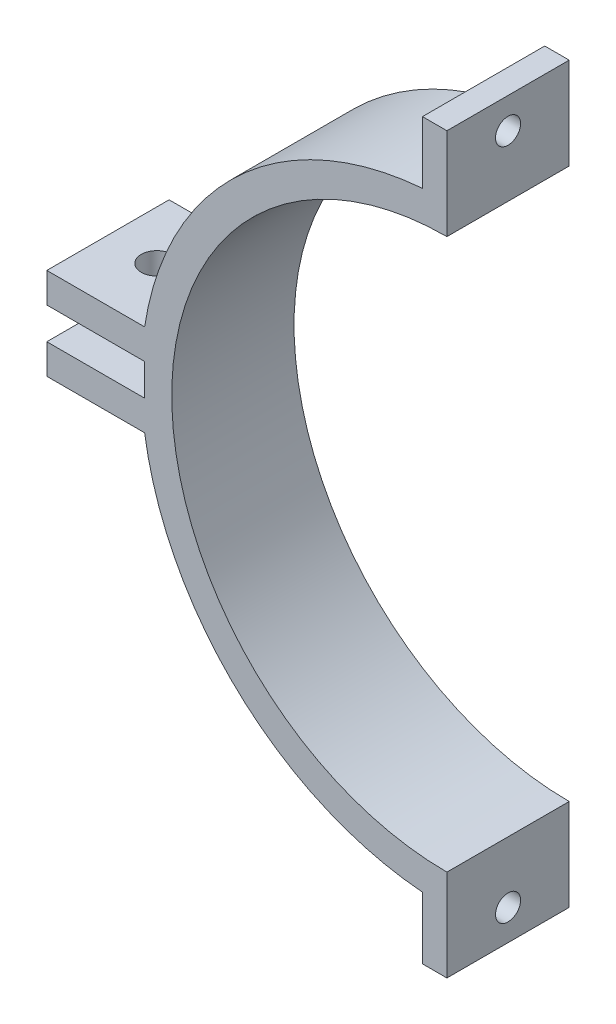
ISO-10303-21;
HEADER;
FILE_DESCRIPTION(('STEP AP214'),'2;1');
FILE_NAME('part.step','',(''),(''),'','','');
FILE_SCHEMA(('AUTOMOTIVE_DESIGN { 1 0 10303 214 1 1 1 1 }'));
ENDSEC;
DATA;
#1=APPLICATION_CONTEXT('core data for automotive mechanical design processes');
#2=APPLICATION_PROTOCOL_DEFINITION('international standard','automotive_design',2000,#1);
#3=PRODUCT_CONTEXT('',#1,'mechanical');
#4=PRODUCT('Part','Part','',(#3));
#5=PRODUCT_RELATED_PRODUCT_CATEGORY('part','',(#4));
#6=PRODUCT_DEFINITION_FORMATION('','',#4);
#7=PRODUCT_DEFINITION_CONTEXT('part definition',#1,'design');
#8=PRODUCT_DEFINITION('design','',#6,#7);
#9=PRODUCT_DEFINITION_SHAPE('','',#8);
#10=(LENGTH_UNIT() NAMED_UNIT(*) SI_UNIT(.MILLI.,.METRE.));
#11=(NAMED_UNIT(*) PLANE_ANGLE_UNIT() SI_UNIT($,.RADIAN.));
#12=(NAMED_UNIT(*) SI_UNIT($,.STERADIAN.) SOLID_ANGLE_UNIT());
#13=UNCERTAINTY_MEASURE_WITH_UNIT(LENGTH_MEASURE(1.E-05),#10,'distance_accuracy_value','');
#14=(GEOMETRIC_REPRESENTATION_CONTEXT(3) GLOBAL_UNCERTAINTY_ASSIGNED_CONTEXT((#13)) GLOBAL_UNIT_ASSIGNED_CONTEXT((#10,
#11,#12)) REPRESENTATION_CONTEXT('',''));
#15=CARTESIAN_POINT('',(0.,0.,0.));
#16=DIRECTION('',(0.,0.,1.));
#17=DIRECTION('',(1.,0.,0.));
#18=AXIS2_PLACEMENT_3D('',#15,#16,#17);
#19=CARTESIAN_POINT('',(0.,0.,0.));
#20=DIRECTION('',(0.,0.,1.));
#21=DIRECTION('',(1.,0.,0.));
#22=AXIS2_PLACEMENT_3D('',#19,#20,#21);
#23=PLANE('',#22);
#24=DIRECTION('',(-1.,0.,0.));
#25=VECTOR('',#24,1.);
#26=CARTESIAN_POINT('',(-49.434299833213,2.6,0.));
#27=LINE('',#26,#25);
#28=CARTESIAN_POINT('',(-49.434299833213,2.6,0.));
#29=VERTEX_POINT('',#28);
#30=CARTESIAN_POINT('',(-65.434299833213,2.6,0.));
#31=VERTEX_POINT('',#30);
#32=EDGE_CURVE('E446',#29,#31,#27,.T.);
#33=ORIENTED_EDGE('',*,*,#32,.T.);
#34=DIRECTION('',(0.,1.,0.));
#35=VECTOR('',#34,1.);
#36=CARTESIAN_POINT('',(-65.434299833213,0.,0.));
#37=LINE('',#36,#35);
#38=CARTESIAN_POINT('',(-65.434299833213,7.5,0.));
#39=VERTEX_POINT('',#38);
#40=EDGE_CURVE('E294',#31,#39,#37,.T.);
#41=ORIENTED_EDGE('',*,*,#40,.T.);
#42=DIRECTION('',(-1.,0.,0.));
#43=VECTOR('',#42,1.);
#44=CARTESIAN_POINT('',(0.,7.50000000000001,0.));
#45=LINE('',#44,#43);
#46=CARTESIAN_POINT('',(-49.434299833213,7.5,0.));
#47=VERTEX_POINT('',#46);
#48=EDGE_CURVE('E291',#47,#39,#45,.T.);
#49=ORIENTED_EDGE('',*,*,#48,.F.);
#50=CARTESIAN_POINT('',(0.,0.,0.));
#51=DIRECTION('',(0.,0.,1.));
#52=DIRECTION('',(1.,0.,0.));
#53=AXIS2_PLACEMENT_3D('',#50,#51,#52);
#54=CIRCLE('',#53,50.);
#55=CARTESIAN_POINT('',(-4.,49.8397431775085,0.));
#56=VERTEX_POINT('',#55);
#57=EDGE_CURVE('E335',#56,#47,#54,.T.);
#58=ORIENTED_EDGE('',*,*,#57,.F.);
#59=DIRECTION('',(0.,-1.,0.));
#60=VECTOR('',#59,1.);
#61=CARTESIAN_POINT('',(-3.99999999999999,0.,0.));
#62=LINE('',#61,#60);
#63=CARTESIAN_POINT('',(-4.,60.,0.));
#64=VERTEX_POINT('',#63);
#65=EDGE_CURVE('E333',#64,#56,#62,.T.);
#66=ORIENTED_EDGE('',*,*,#65,.F.);
#67=DIRECTION('',(-1.,0.,0.));
#68=VECTOR('',#67,1.);
#69=CARTESIAN_POINT('',(0.,60.,0.));
#70=LINE('',#69,#68);
#71=CARTESIAN_POINT('',(0.,60.,0.));
#72=VERTEX_POINT('',#71);
#73=EDGE_CURVE('E264',#72,#64,#70,.T.);
#74=ORIENTED_EDGE('',*,*,#73,.F.);
#75=DIRECTION('',(0.,1.,0.));
#76=VECTOR('',#75,1.);
#77=CARTESIAN_POINT('',(0.,0.,0.));
#78=LINE('',#77,#76);
#79=CARTESIAN_POINT('',(0.,45.,0.));
#80=VERTEX_POINT('',#79);
#81=EDGE_CURVE('E248',#80,#72,#78,.T.);
#82=ORIENTED_EDGE('',*,*,#81,.F.);
#83=CARTESIAN_POINT('',(0.,0.,0.));
#84=DIRECTION('',(0.,0.,1.));
#85=DIRECTION('',(1.,0.,0.));
#86=AXIS2_PLACEMENT_3D('',#83,#84,#85);
#87=CIRCLE('',#86,45.);
#88=CARTESIAN_POINT('',(0.,-45.,0.));
#89=VERTEX_POINT('',#88);
#90=EDGE_CURVE('E262',#80,#89,#87,.T.);
#91=ORIENTED_EDGE('',*,*,#90,.T.);
#92=DIRECTION('',(0.,-1.,0.));
#93=VECTOR('',#92,1.);
#94=CARTESIAN_POINT('',(0.,0.,0.));
#95=LINE('',#94,#93);
#96=CARTESIAN_POINT('',(0.,-60.,0.));
#97=VERTEX_POINT('',#96);
#98=EDGE_CURVE('E270',#89,#97,#95,.T.);
#99=ORIENTED_EDGE('',*,*,#98,.T.);
#100=DIRECTION('',(-1.,0.,0.));
#101=VECTOR('',#100,1.);
#102=CARTESIAN_POINT('',(0.,-60.,0.));
#103=LINE('',#102,#101);
#104=CARTESIAN_POINT('',(-4.,-60.,0.));
#105=VERTEX_POINT('',#104);
#106=EDGE_CURVE('E274',#97,#105,#103,.T.);
#107=ORIENTED_EDGE('',*,*,#106,.T.);
#108=DIRECTION('',(0.,1.,0.));
#109=VECTOR('',#108,1.);
#110=CARTESIAN_POINT('',(-3.99999999999999,0.,0.));
#111=LINE('',#110,#109);
#112=CARTESIAN_POINT('',(-4.,-49.8397431775085,0.));
#113=VERTEX_POINT('',#112);
#114=EDGE_CURVE('E339',#105,#113,#111,.T.);
#115=ORIENTED_EDGE('',*,*,#114,.T.);
#116=CARTESIAN_POINT('',(-49.434299833213,-7.5,0.));
#117=VERTEX_POINT('',#116);
#118=EDGE_CURVE('E338',#117,#113,#54,.T.);
#119=ORIENTED_EDGE('',*,*,#118,.F.);
#120=DIRECTION('',(-1.,0.,0.));
#121=VECTOR('',#120,1.);
#122=CARTESIAN_POINT('',(0.,-7.49999999999999,0.));
#123=LINE('',#122,#121);
#124=CARTESIAN_POINT('',(-65.434299833213,-7.5,0.));
#125=VERTEX_POINT('',#124);
#126=EDGE_CURVE('E306',#117,#125,#123,.T.);
#127=ORIENTED_EDGE('',*,*,#126,.T.);
#128=CARTESIAN_POINT('',(-65.434299833213,-2.6,0.));
#129=VERTEX_POINT('',#128);
#130=EDGE_CURVE('E299',#125,#129,#37,.T.);
#131=ORIENTED_EDGE('',*,*,#130,.T.);
#132=DIRECTION('',(-1.,0.,0.));
#133=VECTOR('',#132,1.);
#134=CARTESIAN_POINT('',(-49.434299833213,-2.6,0.));
#135=LINE('',#134,#133);
#136=CARTESIAN_POINT('',(-49.434299833213,-2.6,0.));
#137=VERTEX_POINT('',#136);
#138=EDGE_CURVE('E370',#137,#129,#135,.T.);
#139=ORIENTED_EDGE('',*,*,#138,.F.);
#140=DIRECTION('',(0.,-1.,0.));
#141=VECTOR('',#140,1.);
#142=CARTESIAN_POINT('',(-49.434299833213,0.,0.));
#143=LINE('',#142,#141);
#144=EDGE_CURVE('E437',#29,#137,#143,.T.);
#145=ORIENTED_EDGE('',*,*,#144,.F.);
#146=EDGE_LOOP('',(#33,#41,#49,#58,#66,#74,#82,#91,#99,#107,#115,#119,#127,#131,#139,#145));
#147=FACE_BOUND('',#146,.T.);
#148=ADVANCED_FACE('F151',(#147),#23,.F.);
#149=CARTESIAN_POINT('',(-65.434299833213,0.,20.));
#150=DIRECTION('',(-1.,0.,0.));
#151=DIRECTION('',(0.,0.,1.));
#152=AXIS2_PLACEMENT_3D('',#149,#150,#151);
#153=PLANE('',#152);
#154=ORIENTED_EDGE('',*,*,#40,.F.);
#155=DIRECTION('',(0.,0.,1.));
#156=VECTOR('',#155,1.);
#157=CARTESIAN_POINT('',(-65.434299833213,2.6,0.));
#158=LINE('',#157,#156);
#159=CARTESIAN_POINT('',(-65.434299833213,2.6,20.));
#160=VERTEX_POINT('',#159);
#161=EDGE_CURVE('E393',#31,#160,#158,.T.);
#162=ORIENTED_EDGE('',*,*,#161,.T.);
#163=DIRECTION('',(0.,1.,0.));
#164=VECTOR('',#163,1.);
#165=CARTESIAN_POINT('',(-65.434299833213,0.,20.));
#166=LINE('',#165,#164);
#167=CARTESIAN_POINT('',(-65.434299833213,7.5,20.));
#168=VERTEX_POINT('',#167);
#169=EDGE_CURVE('E389',#160,#168,#166,.T.);
#170=ORIENTED_EDGE('',*,*,#169,.T.);
#171=DIRECTION('',(0.,0.,-1.));
#172=VECTOR('',#171,1.);
#173=CARTESIAN_POINT('',(-65.434299833213,7.5,20.));
#174=LINE('',#173,#172);
#175=EDGE_CURVE('E160',#168,#39,#174,.T.);
#176=ORIENTED_EDGE('',*,*,#175,.T.);
#177=EDGE_LOOP('',(#154,#162,#170,#176));
#178=FACE_BOUND('',#177,.T.);
#179=ADVANCED_FACE('F392',(#178),#153,.T.);
#180=CARTESIAN_POINT('',(0.,0.,20.));
#181=DIRECTION('',(0.,0.,1.));
#182=DIRECTION('',(1.,0.,0.));
#183=AXIS2_PLACEMENT_3D('',#180,#181,#182);
#184=PLANE('',#183);
#185=ORIENTED_EDGE('',*,*,#169,.F.);
#186=DIRECTION('',(-1.,0.,0.));
#187=VECTOR('',#186,1.);
#188=CARTESIAN_POINT('',(-49.434299833213,2.6,20.));
#189=LINE('',#188,#187);
#190=CARTESIAN_POINT('',(-49.434299833213,2.6,20.));
#191=VERTEX_POINT('',#190);
#192=EDGE_CURVE('E449',#191,#160,#189,.T.);
#193=ORIENTED_EDGE('',*,*,#192,.F.);
#194=DIRECTION('',(0.,1.,0.));
#195=VECTOR('',#194,1.);
#196=CARTESIAN_POINT('',(-49.434299833213,0.,20.));
#197=LINE('',#196,#195);
#198=CARTESIAN_POINT('',(-49.434299833213,-2.6,20.));
#199=VERTEX_POINT('',#198);
#200=EDGE_CURVE('E440',#199,#191,#197,.T.);
#201=ORIENTED_EDGE('',*,*,#200,.F.);
#202=DIRECTION('',(-1.,0.,0.));
#203=VECTOR('',#202,1.);
#204=CARTESIAN_POINT('',(-49.434299833213,-2.6,20.));
#205=LINE('',#204,#203);
#206=CARTESIAN_POINT('',(-65.434299833213,-2.6,20.));
#207=VERTEX_POINT('',#206);
#208=EDGE_CURVE('E451',#199,#207,#205,.T.);
#209=ORIENTED_EDGE('',*,*,#208,.T.);
#210=CARTESIAN_POINT('',(-65.434299833213,-7.5,20.));
#211=VERTEX_POINT('',#210);
#212=EDGE_CURVE('E396',#211,#207,#166,.T.);
#213=ORIENTED_EDGE('',*,*,#212,.F.);
#214=DIRECTION('',(-1.,0.,0.));
#215=VECTOR('',#214,1.);
#216=CARTESIAN_POINT('',(0.,-7.49999999999999,20.));
#217=LINE('',#216,#215);
#218=CARTESIAN_POINT('',(-49.434299833213,-7.5,20.));
#219=VERTEX_POINT('',#218);
#220=EDGE_CURVE('E302',#219,#211,#217,.T.);
#221=ORIENTED_EDGE('',*,*,#220,.F.);
#222=CARTESIAN_POINT('',(0.,0.,20.));
#223=DIRECTION('',(0.,0.,1.));
#224=DIRECTION('',(1.,0.,0.));
#225=AXIS2_PLACEMENT_3D('',#222,#223,#224);
#226=CIRCLE('',#225,50.);
#227=CARTESIAN_POINT('',(-4.,-49.8397431775085,20.));
#228=VERTEX_POINT('',#227);
#229=EDGE_CURVE('E321',#219,#228,#226,.T.);
#230=ORIENTED_EDGE('',*,*,#229,.T.);
#231=DIRECTION('',(0.,1.,0.));
#232=VECTOR('',#231,1.);
#233=CARTESIAN_POINT('',(-3.99999999999999,0.,20.));
#234=LINE('',#233,#232);
#235=CARTESIAN_POINT('',(-4.,-60.,20.));
#236=VERTEX_POINT('',#235);
#237=EDGE_CURVE('E322',#236,#228,#234,.T.);
#238=ORIENTED_EDGE('',*,*,#237,.F.);
#239=DIRECTION('',(-1.,0.,0.));
#240=VECTOR('',#239,1.);
#241=CARTESIAN_POINT('',(0.,-60.,20.));
#242=LINE('',#241,#240);
#243=CARTESIAN_POINT('',(0.,-60.,20.));
#244=VERTEX_POINT('',#243);
#245=EDGE_CURVE('E325',#244,#236,#242,.T.);
#246=ORIENTED_EDGE('',*,*,#245,.F.);
#247=DIRECTION('',(0.,-1.,0.));
#248=VECTOR('',#247,1.);
#249=CARTESIAN_POINT('',(0.,0.,20.));
#250=LINE('',#249,#248);
#251=CARTESIAN_POINT('',(0.,-45.,20.));
#252=VERTEX_POINT('',#251);
#253=EDGE_CURVE('E328',#252,#244,#250,.T.);
#254=ORIENTED_EDGE('',*,*,#253,.F.);
#255=CARTESIAN_POINT('',(0.,0.,20.));
#256=DIRECTION('',(0.,0.,1.));
#257=DIRECTION('',(1.,0.,0.));
#258=AXIS2_PLACEMENT_3D('',#255,#256,#257);
#259=CIRCLE('',#258,45.);
#260=CARTESIAN_POINT('',(0.,45.,20.));
#261=VERTEX_POINT('',#260);
#262=EDGE_CURVE('E256',#261,#252,#259,.T.);
#263=ORIENTED_EDGE('',*,*,#262,.F.);
#264=DIRECTION('',(0.,1.,0.));
#265=VECTOR('',#264,1.);
#266=CARTESIAN_POINT('',(0.,0.,20.));
#267=LINE('',#266,#265);
#268=CARTESIAN_POINT('',(0.,60.,20.));
#269=VERTEX_POINT('',#268);
#270=EDGE_CURVE('E250',#261,#269,#267,.T.);
#271=ORIENTED_EDGE('',*,*,#270,.T.);
#272=DIRECTION('',(-1.,0.,0.));
#273=VECTOR('',#272,1.);
#274=CARTESIAN_POINT('',(0.,60.,20.));
#275=LINE('',#274,#273);
#276=CARTESIAN_POINT('',(-4.,60.,20.));
#277=VERTEX_POINT('',#276);
#278=EDGE_CURVE('E272',#269,#277,#275,.T.);
#279=ORIENTED_EDGE('',*,*,#278,.T.);
#280=DIRECTION('',(0.,-1.,0.));
#281=VECTOR('',#280,1.);
#282=CARTESIAN_POINT('',(-3.99999999999999,0.,20.));
#283=LINE('',#282,#281);
#284=CARTESIAN_POINT('',(-4.,49.8397431775085,20.));
#285=VERTEX_POINT('',#284);
#286=EDGE_CURVE('E316',#277,#285,#283,.T.);
#287=ORIENTED_EDGE('',*,*,#286,.T.);
#288=CARTESIAN_POINT('',(-49.434299833213,7.5,20.));
#289=VERTEX_POINT('',#288);
#290=EDGE_CURVE('E318',#285,#289,#226,.T.);
#291=ORIENTED_EDGE('',*,*,#290,.T.);
#292=DIRECTION('',(-1.,0.,0.));
#293=VECTOR('',#292,1.);
#294=CARTESIAN_POINT('',(0.,7.50000000000001,20.));
#295=LINE('',#294,#293);
#296=EDGE_CURVE('E309',#289,#168,#295,.T.);
#297=ORIENTED_EDGE('',*,*,#296,.T.);
#298=EDGE_LOOP('',(#185,#193,#201,#209,#213,#221,#230,#238,#246,#254,#263,#271,#279,#287,#291,#297));
#299=FACE_BOUND('',#298,.T.);
#300=ADVANCED_FACE('F398',(#299),#184,.T.);
#301=CARTESIAN_POINT('',(0.,7.50000000000001,20.));
#302=DIRECTION('',(0.,-1.,0.));
#303=DIRECTION('',(1.,0.,0.));
#304=AXIS2_PLACEMENT_3D('',#301,#302,#303);
#305=PLANE('',#304);
#306=CARTESIAN_POINT('',(-57.434299833213,7.5,10.));
#307=DIRECTION('',(0.,1.,0.));
#308=DIRECTION('',(-1.,0.,0.));
#309=AXIS2_PLACEMENT_3D('',#306,#307,#308);
#310=CIRCLE('',#309,2.55);
#311=CARTESIAN_POINT('',(-59.984299833213,7.5,10.));
#312=VERTEX_POINT('',#311);
#313=EDGE_CURVE('E654',#312,#312,#310,.T.);
#314=ORIENTED_EDGE('',*,*,#313,.F.);
#315=EDGE_LOOP('',(#314));
#316=FACE_BOUND('',#315,.T.);
#317=ORIENTED_EDGE('',*,*,#48,.T.);
#318=ORIENTED_EDGE('',*,*,#175,.F.);
#319=ORIENTED_EDGE('',*,*,#296,.F.);
#320=DIRECTION('',(0.,0.,-1.));
#321=VECTOR('',#320,1.);
#322=CARTESIAN_POINT('',(-49.434299833213,7.5,20.));
#323=LINE('',#322,#321);
#324=EDGE_CURVE('E12',#289,#47,#323,.T.);
#325=ORIENTED_EDGE('',*,*,#324,.T.);
#326=EDGE_LOOP('',(#317,#318,#319,#325));
#327=FACE_BOUND('',#326,.T.);
#328=ADVANCED_FACE('F401',(#316,#327),#305,.F.);
#329=DIRECTION('',(0.,0.,1.));
#330=VECTOR('',#329,1.);
#331=CARTESIAN_POINT('',(-65.434299833213,-2.6,0.));
#332=LINE('',#331,#330);
#333=EDGE_CURVE('E365',#129,#207,#332,.T.);
#334=ORIENTED_EDGE('',*,*,#333,.F.);
#335=ORIENTED_EDGE('',*,*,#130,.F.);
#336=DIRECTION('',(0.,0.,-1.));
#337=VECTOR('',#336,1.);
#338=CARTESIAN_POINT('',(-65.434299833213,-7.5,20.));
#339=LINE('',#338,#337);
#340=EDGE_CURVE('E311',#211,#125,#339,.T.);
#341=ORIENTED_EDGE('',*,*,#340,.F.);
#342=ORIENTED_EDGE('',*,*,#212,.T.);
#343=EDGE_LOOP('',(#334,#335,#341,#342));
#344=FACE_BOUND('',#343,.T.);
#345=ADVANCED_FACE('F362',(#344),#153,.T.);
#346=CARTESIAN_POINT('',(0.,-7.49999999999999,20.));
#347=DIRECTION('',(0.,-1.,0.));
#348=DIRECTION('',(1.,0.,0.));
#349=AXIS2_PLACEMENT_3D('',#346,#347,#348);
#350=PLANE('',#349);
#351=CARTESIAN_POINT('',(-57.434299833213,-7.49999999999999,10.));
#352=DIRECTION('',(0.,-1.,0.));
#353=DIRECTION('',(1.,0.,0.));
#354=AXIS2_PLACEMENT_3D('',#351,#352,#353);
#355=CIRCLE('',#354,2.55);
#356=CARTESIAN_POINT('',(-54.884299833213,-7.49999999999999,10.));
#357=VERTEX_POINT('',#356);
#358=EDGE_CURVE('E428',#357,#357,#355,.T.);
#359=ORIENTED_EDGE('',*,*,#358,.F.);
#360=EDGE_LOOP('',(#359));
#361=FACE_BOUND('',#360,.T.);
#362=ORIENTED_EDGE('',*,*,#126,.F.);
#363=DIRECTION('',(0.,0.,-1.));
#364=VECTOR('',#363,1.);
#365=CARTESIAN_POINT('',(-49.434299833213,-7.5,20.));
#366=LINE('',#365,#364);
#367=EDGE_CURVE('E177',#219,#117,#366,.T.);
#368=ORIENTED_EDGE('',*,*,#367,.F.);
#369=ORIENTED_EDGE('',*,*,#220,.T.);
#370=ORIENTED_EDGE('',*,*,#340,.T.);
#371=EDGE_LOOP('',(#362,#368,#369,#370));
#372=FACE_BOUND('',#371,.T.);
#373=ADVANCED_FACE('F355',(#361,#372),#350,.T.);
#374=CARTESIAN_POINT('',(0.,60.,20.));
#375=DIRECTION('',(0.,-1.,0.));
#376=DIRECTION('',(0.,0.,-1.));
#377=AXIS2_PLACEMENT_3D('',#374,#375,#376);
#378=PLANE('',#377);
#379=ORIENTED_EDGE('',*,*,#73,.T.);
#380=DIRECTION('',(0.,0.,-1.));
#381=VECTOR('',#380,1.);
#382=CARTESIAN_POINT('',(-4.,60.,20.));
#383=LINE('',#382,#381);
#384=EDGE_CURVE('E288',#277,#64,#383,.T.);
#385=ORIENTED_EDGE('',*,*,#384,.F.);
#386=ORIENTED_EDGE('',*,*,#278,.F.);
#387=DIRECTION('',(0.,0.,-1.));
#388=VECTOR('',#387,1.);
#389=CARTESIAN_POINT('',(0.,60.,20.));
#390=LINE('',#389,#388);
#391=EDGE_CURVE('E290',#269,#72,#390,.T.);
#392=ORIENTED_EDGE('',*,*,#391,.T.);
#393=EDGE_LOOP('',(#379,#385,#386,#392));
#394=FACE_BOUND('',#393,.T.);
#395=ADVANCED_FACE('F421',(#394),#378,.F.);
#396=CARTESIAN_POINT('',(0.,-60.,20.));
#397=DIRECTION('',(0.,-1.,0.));
#398=DIRECTION('',(0.,0.,-1.));
#399=AXIS2_PLACEMENT_3D('',#396,#397,#398);
#400=PLANE('',#399);
#401=ORIENTED_EDGE('',*,*,#106,.F.);
#402=DIRECTION('',(0.,0.,-1.));
#403=VECTOR('',#402,1.);
#404=CARTESIAN_POINT('',(0.,-60.,20.));
#405=LINE('',#404,#403);
#406=EDGE_CURVE('E279',#244,#97,#405,.T.);
#407=ORIENTED_EDGE('',*,*,#406,.F.);
#408=ORIENTED_EDGE('',*,*,#245,.T.);
#409=DIRECTION('',(0.,0.,-1.));
#410=VECTOR('',#409,1.);
#411=CARTESIAN_POINT('',(-4.,-60.,20.));
#412=LINE('',#411,#410);
#413=EDGE_CURVE('E281',#236,#105,#412,.T.);
#414=ORIENTED_EDGE('',*,*,#413,.T.);
#415=EDGE_LOOP('',(#401,#407,#408,#414));
#416=FACE_BOUND('',#415,.T.);
#417=ADVANCED_FACE('F346',(#416),#400,.T.);
#418=CARTESIAN_POINT('',(0.,0.,20.));
#419=DIRECTION('',(1.,0.,0.));
#420=DIRECTION('',(0.,0.,-1.));
#421=AXIS2_PLACEMENT_3D('',#418,#419,#420);
#422=PLANE('',#421);
#423=CARTESIAN_POINT('',(0.,-55.,10.));
#424=DIRECTION('',(1.,0.,0.));
#425=DIRECTION('',(0.,0.,-1.));
#426=AXIS2_PLACEMENT_3D('',#423,#424,#425);
#427=CIRCLE('',#426,2.05);
#428=CARTESIAN_POINT('',(0.,-55.,7.95));
#429=VERTEX_POINT('',#428);
#430=EDGE_CURVE('E457',#429,#429,#427,.T.);
#431=ORIENTED_EDGE('',*,*,#430,.F.);
#432=EDGE_LOOP('',(#431));
#433=FACE_BOUND('',#432,.T.);
#434=ORIENTED_EDGE('',*,*,#98,.F.);
#435=DIRECTION('',(0.,0.,-1.));
#436=VECTOR('',#435,1.);
#437=CARTESIAN_POINT('',(0.,-45.,20.));
#438=LINE('',#437,#436);
#439=EDGE_CURVE('E255',#252,#89,#438,.T.);
#440=ORIENTED_EDGE('',*,*,#439,.F.);
#441=ORIENTED_EDGE('',*,*,#253,.T.);
#442=ORIENTED_EDGE('',*,*,#406,.T.);
#443=EDGE_LOOP('',(#434,#440,#441,#442));
#444=FACE_BOUND('',#443,.T.);
#445=ADVANCED_FACE('F509',(#433,#444),#422,.T.);
#446=CARTESIAN_POINT('',(0.,0.,20.));
#447=DIRECTION('',(0.,0.,-1.));
#448=DIRECTION('',(-1.,0.,0.));
#449=AXIS2_PLACEMENT_3D('',#446,#447,#448);
#450=CYLINDRICAL_SURFACE('',#449,45.);
#451=ORIENTED_EDGE('',*,*,#90,.F.);
#452=DIRECTION('',(0.,0.,-1.));
#453=VECTOR('',#452,1.);
#454=CARTESIAN_POINT('',(0.,45.,20.));
#455=LINE('',#454,#453);
#456=EDGE_CURVE('E245',#261,#80,#455,.T.);
#457=ORIENTED_EDGE('',*,*,#456,.F.);
#458=ORIENTED_EDGE('',*,*,#262,.T.);
#459=ORIENTED_EDGE('',*,*,#439,.T.);
#460=EDGE_LOOP('',(#451,#457,#458,#459));
#461=FACE_BOUND('',#460,.T.);
#462=ADVANCED_FACE('F268',(#461),#450,.F.);
#463=CARTESIAN_POINT('',(0.,0.,20.));
#464=DIRECTION('',(-1.,0.,0.));
#465=DIRECTION('',(0.,0.,1.));
#466=AXIS2_PLACEMENT_3D('',#463,#464,#465);
#467=PLANE('',#466);
#468=CARTESIAN_POINT('',(0.,55.,10.));
#469=DIRECTION('',(-1.,0.,0.));
#470=DIRECTION('',(0.,0.,1.));
#471=AXIS2_PLACEMENT_3D('',#468,#469,#470);
#472=CIRCLE('',#471,2.05);
#473=CARTESIAN_POINT('',(0.,55.,12.05));
#474=VERTEX_POINT('',#473);
#475=EDGE_CURVE('E266',#474,#474,#472,.F.);
#476=ORIENTED_EDGE('',*,*,#475,.F.);
#477=EDGE_LOOP('',(#476));
#478=FACE_BOUND('',#477,.T.);
#479=ORIENTED_EDGE('',*,*,#81,.T.);
#480=ORIENTED_EDGE('',*,*,#391,.F.);
#481=ORIENTED_EDGE('',*,*,#270,.F.);
#482=ORIENTED_EDGE('',*,*,#456,.T.);
#483=EDGE_LOOP('',(#479,#480,#481,#482));
#484=FACE_BOUND('',#483,.T.);
#485=ADVANCED_FACE('F153',(#478,#484),#467,.F.);
#486=CARTESIAN_POINT('',(-3.99999999999999,0.,20.));
#487=DIRECTION('',(1.,0.,0.));
#488=DIRECTION('',(0.,1.,0.));
#489=AXIS2_PLACEMENT_3D('',#486,#487,#488);
#490=PLANE('',#489);
#491=CARTESIAN_POINT('',(-4.,55.,10.));
#492=DIRECTION('',(-1.,0.,0.));
#493=DIRECTION('',(0.,-1.,0.));
#494=AXIS2_PLACEMENT_3D('',#491,#492,#493);
#495=CIRCLE('',#494,2.05);
#496=CARTESIAN_POINT('',(-4.,52.95,10.));
#497=VERTEX_POINT('',#496);
#498=EDGE_CURVE('E460',#497,#497,#495,.T.);
#499=ORIENTED_EDGE('',*,*,#498,.F.);
#500=EDGE_LOOP('',(#499));
#501=FACE_BOUND('',#500,.T.);
#502=ORIENTED_EDGE('',*,*,#65,.T.);
#503=DIRECTION('',(0.,0.,-1.));
#504=VECTOR('',#503,1.);
#505=CARTESIAN_POINT('',(-4.,49.8397431775085,20.));
#506=LINE('',#505,#504);
#507=EDGE_CURVE('E285',#285,#56,#506,.T.);
#508=ORIENTED_EDGE('',*,*,#507,.F.);
#509=ORIENTED_EDGE('',*,*,#286,.F.);
#510=ORIENTED_EDGE('',*,*,#384,.T.);
#511=EDGE_LOOP('',(#502,#508,#509,#510));
#512=FACE_BOUND('',#511,.T.);
#513=ADVANCED_FACE('F502',(#501,#512),#490,.F.);
#514=CARTESIAN_POINT('',(-3.99999999999999,0.,20.));
#515=DIRECTION('',(-1.,0.,0.));
#516=DIRECTION('',(0.,-1.,0.));
#517=AXIS2_PLACEMENT_3D('',#514,#515,#516);
#518=PLANE('',#517);
#519=CARTESIAN_POINT('',(-4.,-55.,10.));
#520=DIRECTION('',(1.,0.,0.));
#521=DIRECTION('',(0.,1.,0.));
#522=AXIS2_PLACEMENT_3D('',#519,#520,#521);
#523=CIRCLE('',#522,2.05);
#524=CARTESIAN_POINT('',(-4.,-52.95,10.));
#525=VERTEX_POINT('',#524);
#526=EDGE_CURVE('E448',#525,#525,#523,.T.);
#527=ORIENTED_EDGE('',*,*,#526,.T.);
#528=EDGE_LOOP('',(#527));
#529=FACE_BOUND('',#528,.T.);
#530=ORIENTED_EDGE('',*,*,#114,.F.);
#531=ORIENTED_EDGE('',*,*,#413,.F.);
#532=ORIENTED_EDGE('',*,*,#237,.T.);
#533=DIRECTION('',(0.,0.,-1.));
#534=VECTOR('',#533,1.);
#535=CARTESIAN_POINT('',(-4.,-49.8397431775085,20.));
#536=LINE('',#535,#534);
#537=EDGE_CURVE('E283',#228,#113,#536,.T.);
#538=ORIENTED_EDGE('',*,*,#537,.T.);
#539=EDGE_LOOP('',(#530,#531,#532,#538));
#540=FACE_BOUND('',#539,.T.);
#541=ADVANCED_FACE('F350',(#529,#540),#518,.T.);
#542=CARTESIAN_POINT('',(0.,0.,20.));
#543=DIRECTION('',(0.,0.,-1.));
#544=DIRECTION('',(-1.,0.,0.));
#545=AXIS2_PLACEMENT_3D('',#542,#543,#544);
#546=CYLINDRICAL_SURFACE('',#545,50.);
#547=ORIENTED_EDGE('',*,*,#118,.T.);
#548=ORIENTED_EDGE('',*,*,#537,.F.);
#549=ORIENTED_EDGE('',*,*,#229,.F.);
#550=ORIENTED_EDGE('',*,*,#367,.T.);
#551=EDGE_LOOP('',(#547,#548,#549,#550));
#552=FACE_BOUND('',#551,.T.);
#553=ADVANCED_FACE('F354',(#552),#546,.T.);
#554=ORIENTED_EDGE('',*,*,#57,.T.);
#555=ORIENTED_EDGE('',*,*,#324,.F.);
#556=ORIENTED_EDGE('',*,*,#290,.F.);
#557=ORIENTED_EDGE('',*,*,#507,.T.);
#558=EDGE_LOOP('',(#554,#555,#556,#557));
#559=FACE_BOUND('',#558,.T.);
#560=ADVANCED_FACE('F490',(#559),#546,.T.);
#561=CARTESIAN_POINT('',(0.001000000000001,55.,10.));
#562=DIRECTION('',(-1.,0.,0.));
#563=DIRECTION('',(0.,-1.,0.));
#564=AXIS2_PLACEMENT_3D('',#561,#562,#563);
#565=CYLINDRICAL_SURFACE('',#564,2.05);
#566=ORIENTED_EDGE('',*,*,#498,.T.);
#567=EDGE_LOOP('',(#566));
#568=FACE_BOUND('',#567,.T.);
#569=ORIENTED_EDGE('',*,*,#475,.T.);
#570=EDGE_LOOP('',(#569));
#571=FACE_BOUND('',#570,.T.);
#572=ADVANCED_FACE('F483',(#568,#571),#565,.F.);
#573=CARTESIAN_POINT('',(0.001000000000001,-55.,10.));
#574=DIRECTION('',(-1.,0.,0.));
#575=DIRECTION('',(0.,-1.,0.));
#576=AXIS2_PLACEMENT_3D('',#573,#574,#575);
#577=CYLINDRICAL_SURFACE('',#576,2.05);
#578=ORIENTED_EDGE('',*,*,#430,.T.);
#579=EDGE_LOOP('',(#578));
#580=FACE_BOUND('',#579,.T.);
#581=ORIENTED_EDGE('',*,*,#526,.F.);
#582=EDGE_LOOP('',(#581));
#583=FACE_BOUND('',#582,.T.);
#584=ADVANCED_FACE('F474',(#580,#583),#577,.F.);
#585=CARTESIAN_POINT('',(-49.434299833213,2.6,0.));
#586=DIRECTION('',(0.,-1.,0.));
#587=DIRECTION('',(0.,0.,-1.));
#588=AXIS2_PLACEMENT_3D('',#585,#586,#587);
#589=PLANE('',#588);
#590=CARTESIAN_POINT('',(-57.434299833213,2.6,10.));
#591=DIRECTION('',(0.,-1.,0.));
#592=DIRECTION('',(0.,0.,-1.));
#593=AXIS2_PLACEMENT_3D('',#590,#591,#592);
#594=CIRCLE('',#593,2.55);
#595=CARTESIAN_POINT('',(-57.434299833213,2.6,7.45));
#596=VERTEX_POINT('',#595);
#597=EDGE_CURVE('E430',#596,#596,#594,.T.);
#598=ORIENTED_EDGE('',*,*,#597,.F.);
#599=EDGE_LOOP('',(#598));
#600=FACE_BOUND('',#599,.T.);
#601=ORIENTED_EDGE('',*,*,#161,.F.);
#602=ORIENTED_EDGE('',*,*,#32,.F.);
#603=DIRECTION('',(0.,0.,1.));
#604=VECTOR('',#603,1.);
#605=CARTESIAN_POINT('',(-49.434299833213,2.6,0.));
#606=LINE('',#605,#604);
#607=EDGE_CURVE('E442',#29,#191,#606,.T.);
#608=ORIENTED_EDGE('',*,*,#607,.T.);
#609=ORIENTED_EDGE('',*,*,#192,.T.);
#610=EDGE_LOOP('',(#601,#602,#608,#609));
#611=FACE_BOUND('',#610,.T.);
#612=ADVANCED_FACE('F472',(#600,#611),#589,.T.);
#613=CARTESIAN_POINT('',(-49.434299833213,-2.6,0.));
#614=DIRECTION('',(0.,-1.,0.));
#615=DIRECTION('',(0.,0.,-1.));
#616=AXIS2_PLACEMENT_3D('',#613,#614,#615);
#617=PLANE('',#616);
#618=CARTESIAN_POINT('',(-57.434299833213,-2.6,10.));
#619=DIRECTION('',(0.,-1.,0.));
#620=DIRECTION('',(0.,0.,-1.));
#621=AXIS2_PLACEMENT_3D('',#618,#619,#620);
#622=CIRCLE('',#621,2.55);
#623=CARTESIAN_POINT('',(-57.434299833213,-2.6,7.45));
#624=VERTEX_POINT('',#623);
#625=EDGE_CURVE('E155',#624,#624,#622,.T.);
#626=ORIENTED_EDGE('',*,*,#625,.T.);
#627=EDGE_LOOP('',(#626));
#628=FACE_BOUND('',#627,.T.);
#629=ORIENTED_EDGE('',*,*,#333,.T.);
#630=ORIENTED_EDGE('',*,*,#208,.F.);
#631=DIRECTION('',(0.,0.,1.));
#632=VECTOR('',#631,1.);
#633=CARTESIAN_POINT('',(-49.434299833213,-2.6,0.));
#634=LINE('',#633,#632);
#635=EDGE_CURVE('E168',#137,#199,#634,.T.);
#636=ORIENTED_EDGE('',*,*,#635,.F.);
#637=ORIENTED_EDGE('',*,*,#138,.T.);
#638=EDGE_LOOP('',(#629,#630,#636,#637));
#639=FACE_BOUND('',#638,.T.);
#640=ADVANCED_FACE('F465',(#628,#639),#617,.F.);
#641=CARTESIAN_POINT('',(-49.434299833213,0.,0.));
#642=DIRECTION('',(-1.,0.,0.));
#643=DIRECTION('',(0.,0.,1.));
#644=AXIS2_PLACEMENT_3D('',#641,#642,#643);
#645=PLANE('',#644);
#646=ORIENTED_EDGE('',*,*,#144,.T.);
#647=ORIENTED_EDGE('',*,*,#635,.T.);
#648=ORIENTED_EDGE('',*,*,#200,.T.);
#649=ORIENTED_EDGE('',*,*,#607,.F.);
#650=EDGE_LOOP('',(#646,#647,#648,#649));
#651=FACE_BOUND('',#650,.T.);
#652=ADVANCED_FACE('F469',(#651),#645,.T.);
#653=CARTESIAN_POINT('',(-57.434299833213,-60.,10.));
#654=DIRECTION('',(0.,1.,0.));
#655=DIRECTION('',(-1.,0.,0.));
#656=AXIS2_PLACEMENT_3D('',#653,#654,#655);
#657=CYLINDRICAL_SURFACE('',#656,2.55);
#658=ORIENTED_EDGE('',*,*,#358,.T.);
#659=EDGE_LOOP('',(#658));
#660=FACE_BOUND('',#659,.T.);
#661=ORIENTED_EDGE('',*,*,#625,.F.);
#662=EDGE_LOOP('',(#661));
#663=FACE_BOUND('',#662,.T.);
#664=ADVANCED_FACE('F603',(#660,#663),#657,.F.);
#665=ORIENTED_EDGE('',*,*,#597,.T.);
#666=EDGE_LOOP('',(#665));
#667=FACE_BOUND('',#666,.T.);
#668=ORIENTED_EDGE('',*,*,#313,.T.);
#669=EDGE_LOOP('',(#668));
#670=FACE_BOUND('',#669,.T.);
#671=ADVANCED_FACE('F634',(#667,#670),#657,.F.);
#672=CLOSED_SHELL('',(#148,#179,#300,#328,#345,#373,#395,#417,#445,#462,#485,#513,#541,#553,
#560,#572,#584,#612,#640,#652,#664,#671));
#673=MANIFOLD_SOLID_BREP('B2',#672);
#674=ADVANCED_BREP_SHAPE_REPRESENTATION('',(#18,#673),#14);
#675=SHAPE_DEFINITION_REPRESENTATION(#9,#674);
ENDSEC;
END-ISO-10303-21;
